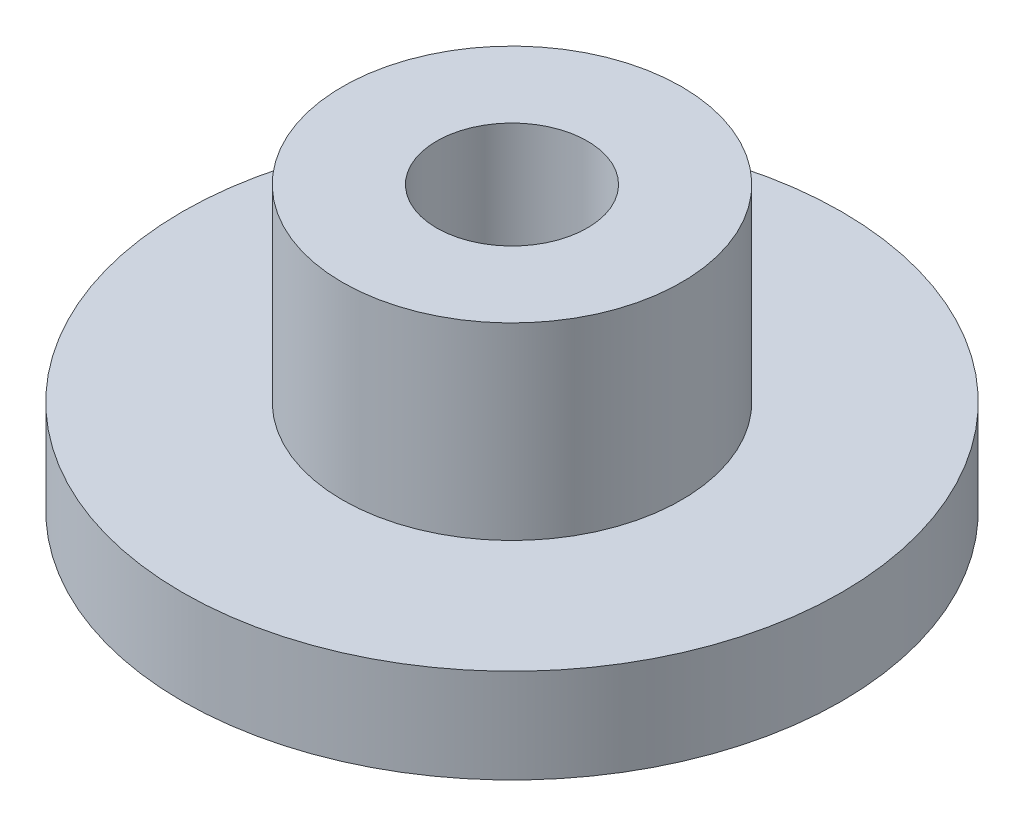
ISO-10303-21;
HEADER;
FILE_DESCRIPTION(('STEP AP214'),'2;1');
FILE_NAME('part.step','',(''),(''),'','','');
FILE_SCHEMA(('AUTOMOTIVE_DESIGN { 1 0 10303 214 1 1 1 1 }'));
ENDSEC;
DATA;
#1=APPLICATION_CONTEXT('core data for automotive mechanical design processes');
#2=APPLICATION_PROTOCOL_DEFINITION('international standard','automotive_design',2000,#1);
#3=PRODUCT_CONTEXT('',#1,'mechanical');
#4=PRODUCT('Part','Part','',(#3));
#5=PRODUCT_RELATED_PRODUCT_CATEGORY('part','',(#4));
#6=PRODUCT_DEFINITION_FORMATION('','',#4);
#7=PRODUCT_DEFINITION_CONTEXT('part definition',#1,'design');
#8=PRODUCT_DEFINITION('design','',#6,#7);
#9=PRODUCT_DEFINITION_SHAPE('','',#8);
#10=(LENGTH_UNIT() NAMED_UNIT(*) SI_UNIT(.MILLI.,.METRE.));
#11=(NAMED_UNIT(*) PLANE_ANGLE_UNIT() SI_UNIT($,.RADIAN.));
#12=(NAMED_UNIT(*) SI_UNIT($,.STERADIAN.) SOLID_ANGLE_UNIT());
#13=UNCERTAINTY_MEASURE_WITH_UNIT(LENGTH_MEASURE(1.E-05),#10,'distance_accuracy_value','');
#14=(GEOMETRIC_REPRESENTATION_CONTEXT(3) GLOBAL_UNCERTAINTY_ASSIGNED_CONTEXT((#13)) GLOBAL_UNIT_ASSIGNED_CONTEXT((#10,
#11,#12)) REPRESENTATION_CONTEXT('',''));
#15=CARTESIAN_POINT('',(0.,0.,0.));
#16=DIRECTION('',(0.,0.,1.));
#17=DIRECTION('',(1.,0.,0.));
#18=AXIS2_PLACEMENT_3D('',#15,#16,#17);
#19=CARTESIAN_POINT('',(0.,5.,0.));
#20=DIRECTION('',(0.,1.,0.));
#21=DIRECTION('',(0.,0.,1.));
#22=AXIS2_PLACEMENT_3D('',#19,#20,#21);
#23=PLANE('',#22);
#24=CARTESIAN_POINT('',(0.,5.,0.));
#25=DIRECTION('',(0.,1.,0.));
#26=DIRECTION('',(0.,0.,1.));
#27=AXIS2_PLACEMENT_3D('',#24,#25,#26);
#28=CIRCLE('',#27,2.5);
#29=CARTESIAN_POINT('',(0.,5.,2.5));
#30=VERTEX_POINT('',#29);
#31=EDGE_CURVE('E47',#30,#30,#28,.T.);
#32=ORIENTED_EDGE('',*,*,#31,.F.);
#33=EDGE_LOOP('',(#32));
#34=FACE_BOUND('',#33,.T.);
#35=CARTESIAN_POINT('',(0.,5.,0.));
#36=DIRECTION('',(0.,1.,0.));
#37=DIRECTION('',(0.,0.,1.));
#38=AXIS2_PLACEMENT_3D('',#35,#36,#37);
#39=CIRCLE('',#38,4.);
#40=CARTESIAN_POINT('',(0.,5.,4.));
#41=VERTEX_POINT('',#40);
#42=EDGE_CURVE('E10',#41,#41,#39,.F.);
#43=ORIENTED_EDGE('',*,*,#42,.F.);
#44=EDGE_LOOP('',(#43));
#45=FACE_BOUND('',#44,.T.);
#46=ADVANCED_FACE('F31',(#34,#45),#23,.T.);
#47=CARTESIAN_POINT('',(0.,5.,0.));
#48=DIRECTION('',(0.,1.,0.));
#49=DIRECTION('',(0.,0.,1.));
#50=AXIS2_PLACEMENT_3D('',#47,#48,#49);
#51=CIRCLE('',#50,9.);
#52=CARTESIAN_POINT('',(0.,5.,9.));
#53=VERTEX_POINT('',#52);
#54=EDGE_CURVE('E55',#53,#53,#51,.T.);
#55=ORIENTED_EDGE('',*,*,#54,.F.);
#56=EDGE_LOOP('',(#55));
#57=FACE_BOUND('',#56,.T.);
#58=CARTESIAN_POINT('',(0.,5.,0.));
#59=DIRECTION('',(0.,1.,0.));
#60=DIRECTION('',(0.,0.,1.));
#61=AXIS2_PLACEMENT_3D('',#58,#59,#60);
#62=CIRCLE('',#61,17.5);
#63=CARTESIAN_POINT('',(0.,5.,17.5));
#64=VERTEX_POINT('',#63);
#65=EDGE_CURVE('E38',#64,#64,#62,.T.);
#66=ORIENTED_EDGE('',*,*,#65,.T.);
#67=EDGE_LOOP('',(#66));
#68=FACE_BOUND('',#67,.T.);
#69=ADVANCED_FACE('F82',(#57,#68),#23,.T.);
#70=CARTESIAN_POINT('',(0.,0.,0.));
#71=DIRECTION('',(0.,1.,0.));
#72=DIRECTION('',(0.,0.,1.));
#73=AXIS2_PLACEMENT_3D('',#70,#71,#72);
#74=PLANE('',#73);
#75=CARTESIAN_POINT('',(0.,0.,0.));
#76=DIRECTION('',(0.,1.,0.));
#77=DIRECTION('',(0.,0.,1.));
#78=AXIS2_PLACEMENT_3D('',#75,#76,#77);
#79=CIRCLE('',#78,17.5);
#80=CARTESIAN_POINT('',(0.,0.,17.5));
#81=VERTEX_POINT('',#80);
#82=EDGE_CURVE('E42',#81,#81,#79,.T.);
#83=ORIENTED_EDGE('',*,*,#82,.F.);
#84=EDGE_LOOP('',(#83));
#85=FACE_BOUND('',#84,.T.);
#86=CARTESIAN_POINT('',(0.,0.,0.));
#87=DIRECTION('',(0.,1.,0.));
#88=DIRECTION('',(0.,0.,1.));
#89=AXIS2_PLACEMENT_3D('',#86,#87,#88);
#90=CIRCLE('',#89,2.5);
#91=CARTESIAN_POINT('',(0.,0.,2.5));
#92=VERTEX_POINT('',#91);
#93=EDGE_CURVE('E49',#92,#92,#90,.T.);
#94=ORIENTED_EDGE('',*,*,#93,.T.);
#95=EDGE_LOOP('',(#94));
#96=FACE_BOUND('',#95,.T.);
#97=ADVANCED_FACE('F88',(#85,#96),#74,.F.);
#98=CARTESIAN_POINT('',(0.,5.,0.));
#99=DIRECTION('',(0.,-1.,0.));
#100=DIRECTION('',(0.,0.,-1.));
#101=AXIS2_PLACEMENT_3D('',#98,#99,#100);
#102=CYLINDRICAL_SURFACE('',#101,17.5);
#103=ORIENTED_EDGE('',*,*,#65,.F.);
#104=EDGE_LOOP('',(#103));
#105=FACE_BOUND('',#104,.T.);
#106=ORIENTED_EDGE('',*,*,#82,.T.);
#107=EDGE_LOOP('',(#106));
#108=FACE_BOUND('',#107,.T.);
#109=ADVANCED_FACE('F33',(#105,#108),#102,.T.);
#110=CARTESIAN_POINT('',(0.,5.,0.));
#111=DIRECTION('',(0.,-1.,0.));
#112=DIRECTION('',(0.,0.,-1.));
#113=AXIS2_PLACEMENT_3D('',#110,#111,#112);
#114=CYLINDRICAL_SURFACE('',#113,2.5);
#115=ORIENTED_EDGE('',*,*,#31,.T.);
#116=EDGE_LOOP('',(#115));
#117=FACE_BOUND('',#116,.T.);
#118=ORIENTED_EDGE('',*,*,#93,.F.);
#119=EDGE_LOOP('',(#118));
#120=FACE_BOUND('',#119,.T.);
#121=ADVANCED_FACE('F69',(#117,#120),#114,.F.);
#122=CARTESIAN_POINT('',(0.,15.,0.));
#123=DIRECTION('',(0.,1.,0.));
#124=DIRECTION('',(0.,0.,1.));
#125=AXIS2_PLACEMENT_3D('',#122,#123,#124);
#126=PLANE('',#125);
#127=CARTESIAN_POINT('',(0.,15.,0.));
#128=DIRECTION('',(0.,1.,0.));
#129=DIRECTION('',(0.,0.,1.));
#130=AXIS2_PLACEMENT_3D('',#127,#128,#129);
#131=CIRCLE('',#130,9.);
#132=CARTESIAN_POINT('',(0.,15.,9.));
#133=VERTEX_POINT('',#132);
#134=EDGE_CURVE('E52',#133,#133,#131,.T.);
#135=ORIENTED_EDGE('',*,*,#134,.T.);
#136=EDGE_LOOP('',(#135));
#137=FACE_BOUND('',#136,.T.);
#138=CARTESIAN_POINT('',(0.,15.,0.));
#139=DIRECTION('',(0.,1.,0.));
#140=DIRECTION('',(0.,0.,1.));
#141=AXIS2_PLACEMENT_3D('',#138,#139,#140);
#142=CIRCLE('',#141,4.);
#143=CARTESIAN_POINT('',(0.,15.,4.));
#144=VERTEX_POINT('',#143);
#145=EDGE_CURVE('E58',#144,#144,#142,.T.);
#146=ORIENTED_EDGE('',*,*,#145,.F.);
#147=EDGE_LOOP('',(#146));
#148=FACE_BOUND('',#147,.T.);
#149=ADVANCED_FACE('F66',(#137,#148),#126,.T.);
#150=CARTESIAN_POINT('',(0.,15.,0.));
#151=DIRECTION('',(0.,-1.,0.));
#152=DIRECTION('',(0.,0.,-1.));
#153=AXIS2_PLACEMENT_3D('',#150,#151,#152);
#154=CYLINDRICAL_SURFACE('',#153,9.);
#155=ORIENTED_EDGE('',*,*,#134,.F.);
#156=EDGE_LOOP('',(#155));
#157=FACE_BOUND('',#156,.T.);
#158=ORIENTED_EDGE('',*,*,#54,.T.);
#159=EDGE_LOOP('',(#158));
#160=FACE_BOUND('',#159,.T.);
#161=ADVANCED_FACE('F68',(#157,#160),#154,.T.);
#162=CARTESIAN_POINT('',(0.,15.,0.));
#163=DIRECTION('',(0.,-1.,0.));
#164=DIRECTION('',(0.,0.,-1.));
#165=AXIS2_PLACEMENT_3D('',#162,#163,#164);
#166=CYLINDRICAL_SURFACE('',#165,4.);
#167=ORIENTED_EDGE('',*,*,#145,.T.);
#168=EDGE_LOOP('',(#167));
#169=FACE_BOUND('',#168,.T.);
#170=ORIENTED_EDGE('',*,*,#42,.T.);
#171=EDGE_LOOP('',(#170));
#172=FACE_BOUND('',#171,.T.);
#173=ADVANCED_FACE('F64',(#169,#172),#166,.F.);
#174=CLOSED_SHELL('',(#46,#69,#97,#109,#121,#149,#161,#173));
#175=MANIFOLD_SOLID_BREP('B2',#174);
#176=ADVANCED_BREP_SHAPE_REPRESENTATION('',(#18,#175),#14);
#177=SHAPE_DEFINITION_REPRESENTATION(#9,#176);
ENDSEC;
END-ISO-10303-21;
